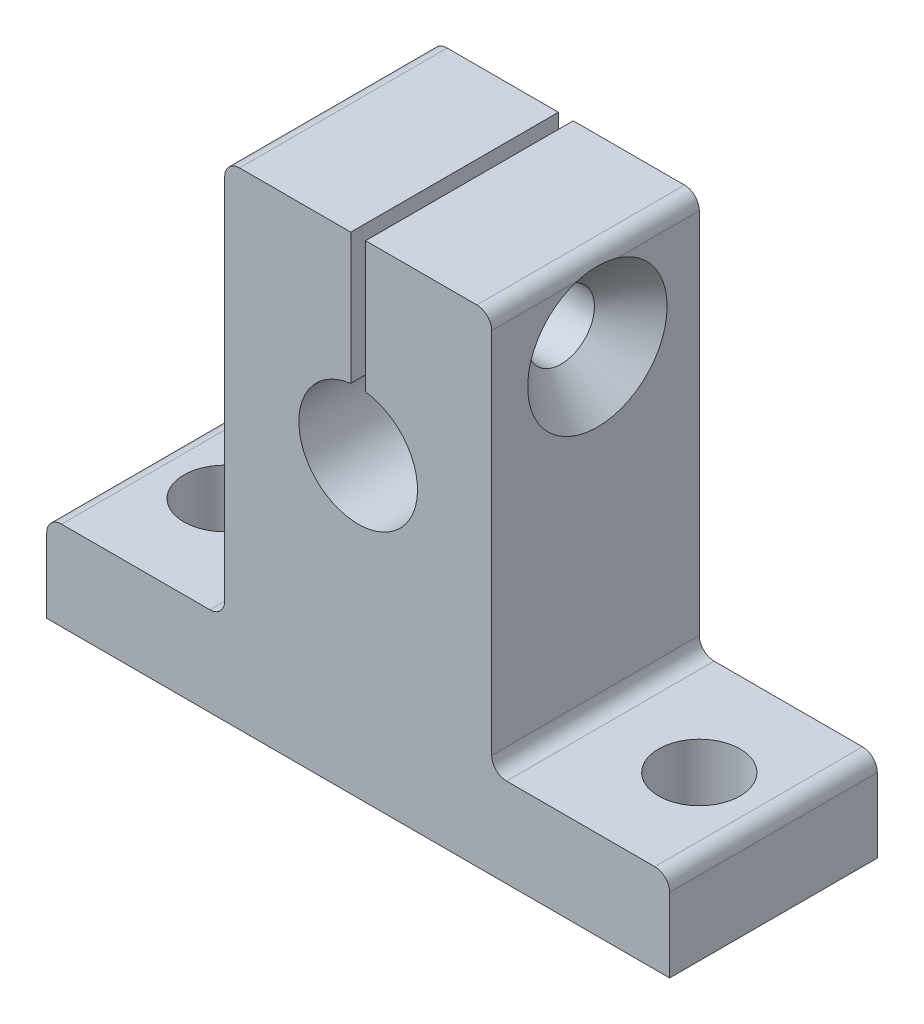
ISO-10303-21;
HEADER;
FILE_DESCRIPTION(('STEP AP214'),'2;1');
FILE_NAME('part.step','',(''),(''),'','','');
FILE_SCHEMA(('AUTOMOTIVE_DESIGN { 1 0 10303 214 1 1 1 1 }'));
ENDSEC;
DATA;
#1=APPLICATION_CONTEXT('core data for automotive mechanical design processes');
#2=APPLICATION_PROTOCOL_DEFINITION('international standard','automotive_design',2000,#1);
#3=PRODUCT_CONTEXT('',#1,'mechanical');
#4=PRODUCT('Part','Part','',(#3));
#5=PRODUCT_RELATED_PRODUCT_CATEGORY('part','',(#4));
#6=PRODUCT_DEFINITION_FORMATION('','',#4);
#7=PRODUCT_DEFINITION_CONTEXT('part definition',#1,'design');
#8=PRODUCT_DEFINITION('design','',#6,#7);
#9=PRODUCT_DEFINITION_SHAPE('','',#8);
#10=(LENGTH_UNIT() NAMED_UNIT(*) SI_UNIT(.MILLI.,.METRE.));
#11=(NAMED_UNIT(*) PLANE_ANGLE_UNIT() SI_UNIT($,.RADIAN.));
#12=(NAMED_UNIT(*) SI_UNIT($,.STERADIAN.) SOLID_ANGLE_UNIT());
#13=UNCERTAINTY_MEASURE_WITH_UNIT(LENGTH_MEASURE(1.E-05),#10,'distance_accuracy_value','');
#14=(GEOMETRIC_REPRESENTATION_CONTEXT(3) GLOBAL_UNCERTAINTY_ASSIGNED_CONTEXT((#13)) GLOBAL_UNIT_ASSIGNED_CONTEXT((#10,
#11,#12)) REPRESENTATION_CONTEXT('',''));
#15=CARTESIAN_POINT('',(0.,0.,0.));
#16=DIRECTION('',(0.,0.,1.));
#17=DIRECTION('',(1.,0.,0.));
#18=AXIS2_PLACEMENT_3D('',#15,#16,#17);
#19=CARTESIAN_POINT('',(-21.,0.,14.));
#20=DIRECTION('',(1.,0.,0.));
#21=DIRECTION('',(0.,0.,-1.));
#22=AXIS2_PLACEMENT_3D('',#19,#20,#21);
#23=PLANE('',#22);
#24=DIRECTION('',(0.,-1.,0.));
#25=VECTOR('',#24,1.);
#26=CARTESIAN_POINT('',(-21.,0.,14.));
#27=LINE('',#26,#25);
#28=CARTESIAN_POINT('',(-21.,5.,14.));
#29=VERTEX_POINT('',#28);
#30=CARTESIAN_POINT('',(-21.,0.,14.));
#31=VERTEX_POINT('',#30);
#32=EDGE_CURVE('E163',#29,#31,#27,.T.);
#33=ORIENTED_EDGE('',*,*,#32,.F.);
#34=DIRECTION('',(0.,0.,-1.));
#35=VECTOR('',#34,1.);
#36=CARTESIAN_POINT('',(-21.,5.,14.));
#37=LINE('',#36,#35);
#38=CARTESIAN_POINT('',(-21.,5.,0.));
#39=VERTEX_POINT('',#38);
#40=EDGE_CURVE('E238',#29,#39,#37,.T.);
#41=ORIENTED_EDGE('',*,*,#40,.T.);
#42=DIRECTION('',(0.,-1.,0.));
#43=VECTOR('',#42,1.);
#44=CARTESIAN_POINT('',(-21.,0.,0.));
#45=LINE('',#44,#43);
#46=CARTESIAN_POINT('',(-21.,0.,0.));
#47=VERTEX_POINT('',#46);
#48=EDGE_CURVE('E188',#39,#47,#45,.T.);
#49=ORIENTED_EDGE('',*,*,#48,.T.);
#50=DIRECTION('',(0.,0.,-1.));
#51=VECTOR('',#50,1.);
#52=CARTESIAN_POINT('',(-21.,0.,14.));
#53=LINE('',#52,#51);
#54=EDGE_CURVE('E181',#31,#47,#53,.T.);
#55=ORIENTED_EDGE('',*,*,#54,.F.);
#56=EDGE_LOOP('',(#33,#41,#49,#55));
#57=FACE_BOUND('',#56,.T.);
#58=ADVANCED_FACE('F32',(#57),#23,.F.);
#59=CARTESIAN_POINT('',(-21.,0.,14.));
#60=DIRECTION('',(0.,1.,0.));
#61=DIRECTION('',(0.,0.,1.));
#62=AXIS2_PLACEMENT_3D('',#59,#60,#61);
#63=PLANE('',#62);
#64=CARTESIAN_POINT('',(-16.,0.,7.));
#65=DIRECTION('',(0.,1.,0.));
#66=DIRECTION('',(0.,0.,1.));
#67=AXIS2_PLACEMENT_3D('',#64,#65,#66);
#68=CIRCLE('',#67,2.75);
#69=CARTESIAN_POINT('',(-16.,0.,9.75));
#70=VERTEX_POINT('',#69);
#71=EDGE_CURVE('E458',#70,#70,#68,.T.);
#72=ORIENTED_EDGE('',*,*,#71,.T.);
#73=EDGE_LOOP('',(#72));
#74=FACE_BOUND('',#73,.T.);
#75=CARTESIAN_POINT('',(16.,0.,7.));
#76=DIRECTION('',(0.,1.,0.));
#77=DIRECTION('',(0.,0.,1.));
#78=AXIS2_PLACEMENT_3D('',#75,#76,#77);
#79=CIRCLE('',#78,2.75);
#80=CARTESIAN_POINT('',(16.,0.,9.75));
#81=VERTEX_POINT('',#80);
#82=EDGE_CURVE('E346',#81,#81,#79,.T.);
#83=ORIENTED_EDGE('',*,*,#82,.T.);
#84=EDGE_LOOP('',(#83));
#85=FACE_BOUND('',#84,.T.);
#86=DIRECTION('',(1.,0.,0.));
#87=VECTOR('',#86,1.);
#88=CARTESIAN_POINT('',(-21.,0.,0.));
#89=LINE('',#88,#87);
#90=CARTESIAN_POINT('',(21.,0.,0.));
#91=VERTEX_POINT('',#90);
#92=EDGE_CURVE('E345',#47,#91,#89,.T.);
#93=ORIENTED_EDGE('',*,*,#92,.T.);
#94=DIRECTION('',(0.,0.,-1.));
#95=VECTOR('',#94,1.);
#96=CARTESIAN_POINT('',(21.,0.,14.));
#97=LINE('',#96,#95);
#98=CARTESIAN_POINT('',(21.,0.,14.));
#99=VERTEX_POINT('',#98);
#100=EDGE_CURVE('E183',#99,#91,#97,.T.);
#101=ORIENTED_EDGE('',*,*,#100,.F.);
#102=DIRECTION('',(1.,0.,0.));
#103=VECTOR('',#102,1.);
#104=CARTESIAN_POINT('',(-21.,0.,14.));
#105=LINE('',#104,#103);
#106=EDGE_CURVE('E167',#31,#99,#105,.T.);
#107=ORIENTED_EDGE('',*,*,#106,.F.);
#108=ORIENTED_EDGE('',*,*,#54,.T.);
#109=EDGE_LOOP('',(#93,#101,#107,#108));
#110=FACE_BOUND('',#109,.T.);
#111=ADVANCED_FACE('F180',(#74,#85,#110),#63,.F.);
#112=CARTESIAN_POINT('',(21.,6.,14.));
#113=DIRECTION('',(-1.,0.,0.));
#114=DIRECTION('',(0.,0.,1.));
#115=AXIS2_PLACEMENT_3D('',#112,#113,#114);
#116=PLANE('',#115);
#117=DIRECTION('',(0.,1.,0.));
#118=VECTOR('',#117,1.);
#119=CARTESIAN_POINT('',(21.,6.,0.));
#120=LINE('',#119,#118);
#121=CARTESIAN_POINT('',(21.,5.,0.));
#122=VERTEX_POINT('',#121);
#123=EDGE_CURVE('E348',#91,#122,#120,.T.);
#124=ORIENTED_EDGE('',*,*,#123,.T.);
#125=DIRECTION('',(0.,0.,-1.));
#126=VECTOR('',#125,1.);
#127=CARTESIAN_POINT('',(21.,5.,14.));
#128=LINE('',#127,#126);
#129=CARTESIAN_POINT('',(21.,5.,14.));
#130=VERTEX_POINT('',#129);
#131=EDGE_CURVE('E230',#122,#130,#128,.F.);
#132=ORIENTED_EDGE('',*,*,#131,.T.);
#133=DIRECTION('',(0.,1.,0.));
#134=VECTOR('',#133,1.);
#135=CARTESIAN_POINT('',(21.,6.,14.));
#136=LINE('',#135,#134);
#137=EDGE_CURVE('E185',#99,#130,#136,.T.);
#138=ORIENTED_EDGE('',*,*,#137,.F.);
#139=ORIENTED_EDGE('',*,*,#100,.T.);
#140=EDGE_LOOP('',(#124,#132,#138,#139));
#141=FACE_BOUND('',#140,.T.);
#142=ADVANCED_FACE('F312',(#141),#116,.F.);
#143=CARTESIAN_POINT('',(9.,6.,14.));
#144=DIRECTION('',(0.,-1.,0.));
#145=DIRECTION('',(0.,0.,-1.));
#146=AXIS2_PLACEMENT_3D('',#143,#144,#145);
#147=PLANE('',#146);
#148=CARTESIAN_POINT('',(16.,6.,7.));
#149=DIRECTION('',(0.,1.,0.));
#150=DIRECTION('',(0.,0.,1.));
#151=AXIS2_PLACEMENT_3D('',#148,#149,#150);
#152=CIRCLE('',#151,2.75);
#153=CARTESIAN_POINT('',(16.,6.,9.75));
#154=VERTEX_POINT('',#153);
#155=EDGE_CURVE('E351',#154,#154,#152,.T.);
#156=ORIENTED_EDGE('',*,*,#155,.F.);
#157=EDGE_LOOP('',(#156));
#158=FACE_BOUND('',#157,.T.);
#159=DIRECTION('',(-1.,0.,0.));
#160=VECTOR('',#159,1.);
#161=CARTESIAN_POINT('',(9.,6.,0.));
#162=LINE('',#161,#160);
#163=CARTESIAN_POINT('',(20.,6.,0.));
#164=VERTEX_POINT('',#163);
#165=CARTESIAN_POINT('',(10.,6.,0.));
#166=VERTEX_POINT('',#165);
#167=EDGE_CURVE('E359',#164,#166,#162,.T.);
#168=ORIENTED_EDGE('',*,*,#167,.T.);
#169=DIRECTION('',(0.,0.,-1.));
#170=VECTOR('',#169,1.);
#171=CARTESIAN_POINT('',(10.,6.,14.));
#172=LINE('',#171,#170);
#173=CARTESIAN_POINT('',(10.,6.,14.));
#174=VERTEX_POINT('',#173);
#175=EDGE_CURVE('E210',#166,#174,#172,.F.);
#176=ORIENTED_EDGE('',*,*,#175,.T.);
#177=DIRECTION('',(-1.,0.,0.));
#178=VECTOR('',#177,1.);
#179=CARTESIAN_POINT('',(9.,6.,14.));
#180=LINE('',#179,#178);
#181=CARTESIAN_POINT('',(20.,6.,14.));
#182=VERTEX_POINT('',#181);
#183=EDGE_CURVE('E432',#182,#174,#180,.T.);
#184=ORIENTED_EDGE('',*,*,#183,.F.);
#185=DIRECTION('',(0.,0.,-1.));
#186=VECTOR('',#185,1.);
#187=CARTESIAN_POINT('',(20.,6.,14.));
#188=LINE('',#187,#186);
#189=EDGE_CURVE('E207',#182,#164,#188,.T.);
#190=ORIENTED_EDGE('',*,*,#189,.T.);
#191=EDGE_LOOP('',(#168,#176,#184,#190));
#192=FACE_BOUND('',#191,.T.);
#193=ADVANCED_FACE('F308',(#158,#192),#147,.F.);
#194=CARTESIAN_POINT('',(9.,32.8,14.));
#195=DIRECTION('',(-1.,0.,0.));
#196=DIRECTION('',(0.,-1.,0.));
#197=AXIS2_PLACEMENT_3D('',#194,#195,#196);
#198=PLANE('',#197);
#199=DIRECTION('',(0.,1.,0.));
#200=VECTOR('',#199,1.);
#201=CARTESIAN_POINT('',(9.,32.8,14.));
#202=LINE('',#201,#200);
#203=CARTESIAN_POINT('',(9.,7.,14.));
#204=VERTEX_POINT('',#203);
#205=CARTESIAN_POINT('',(9.,31.8,14.));
#206=VERTEX_POINT('',#205);
#207=EDGE_CURVE('E431',#204,#206,#202,.T.);
#208=ORIENTED_EDGE('',*,*,#207,.F.);
#209=DIRECTION('',(0.,0.,-1.));
#210=VECTOR('',#209,1.);
#211=CARTESIAN_POINT('',(9.,7.,0.));
#212=LINE('',#211,#210);
#213=CARTESIAN_POINT('',(9.,7.,0.));
#214=VERTEX_POINT('',#213);
#215=EDGE_CURVE('E204',#204,#214,#212,.T.);
#216=ORIENTED_EDGE('',*,*,#215,.T.);
#217=DIRECTION('',(0.,1.,0.));
#218=VECTOR('',#217,1.);
#219=CARTESIAN_POINT('',(9.,32.8,0.));
#220=LINE('',#219,#218);
#221=CARTESIAN_POINT('',(9.,31.8,0.));
#222=VERTEX_POINT('',#221);
#223=EDGE_CURVE('E362',#214,#222,#220,.T.);
#224=ORIENTED_EDGE('',*,*,#223,.T.);
#225=DIRECTION('',(0.,0.,-1.));
#226=VECTOR('',#225,1.);
#227=CARTESIAN_POINT('',(9.,31.8,14.));
#228=LINE('',#227,#226);
#229=CARTESIAN_POINT('',(9.,31.8,5.51490655239453));
#230=VERTEX_POINT('',#229);
#231=EDGE_CURVE('E192',#222,#230,#228,.F.);
#232=ORIENTED_EDGE('',*,*,#231,.T.);
#233=CARTESIAN_POINT('',(9.,27.3,6.87137254901961));
#234=DIRECTION('',(1.,0.,0.));
#235=DIRECTION('',(0.,0.,-1.));
#236=AXIS2_PLACEMENT_3D('',#233,#234,#235);
#237=CIRCLE('',#236,4.7);
#238=CARTESIAN_POINT('',(9.,31.8,8.22783854564468));
#239=VERTEX_POINT('',#238);
#240=EDGE_CURVE('E444',#239,#230,#237,.T.);
#241=ORIENTED_EDGE('',*,*,#240,.F.);
#242=DIRECTION('',(0.,0.,-1.));
#243=VECTOR('',#242,1.);
#244=CARTESIAN_POINT('',(9.,31.8,14.));
#245=LINE('',#244,#243);
#246=EDGE_CURVE('E190',#239,#206,#245,.F.);
#247=ORIENTED_EDGE('',*,*,#246,.T.);
#248=EDGE_LOOP('',(#208,#216,#224,#232,#241,#247));
#249=FACE_BOUND('',#248,.T.);
#250=ADVANCED_FACE('F304',(#249),#198,.F.);
#251=CARTESIAN_POINT('',(0.5,32.8,14.));
#252=DIRECTION('',(0.,-1.,0.));
#253=DIRECTION('',(0.,0.,-1.));
#254=AXIS2_PLACEMENT_3D('',#251,#252,#253);
#255=PLANE('',#254);
#256=DIRECTION('',(-1.,0.,0.));
#257=VECTOR('',#256,1.);
#258=CARTESIAN_POINT('',(0.5,32.8,14.));
#259=LINE('',#258,#257);
#260=CARTESIAN_POINT('',(8.,32.8,14.));
#261=VERTEX_POINT('',#260);
#262=CARTESIAN_POINT('',(0.5,32.8,14.));
#263=VERTEX_POINT('',#262);
#264=EDGE_CURVE('E435',#261,#263,#259,.T.);
#265=ORIENTED_EDGE('',*,*,#264,.F.);
#266=DIRECTION('',(0.,0.,-1.));
#267=VECTOR('',#266,1.);
#268=CARTESIAN_POINT('',(8.,32.8,14.));
#269=LINE('',#268,#267);
#270=CARTESIAN_POINT('',(8.,32.8,0.));
#271=VERTEX_POINT('',#270);
#272=EDGE_CURVE('E240',#261,#271,#269,.T.);
#273=ORIENTED_EDGE('',*,*,#272,.T.);
#274=DIRECTION('',(-1.,0.,0.));
#275=VECTOR('',#274,1.);
#276=CARTESIAN_POINT('',(0.5,32.8,0.));
#277=LINE('',#276,#275);
#278=CARTESIAN_POINT('',(0.5,32.8,0.));
#279=VERTEX_POINT('',#278);
#280=EDGE_CURVE('E365',#271,#279,#277,.T.);
#281=ORIENTED_EDGE('',*,*,#280,.T.);
#282=DIRECTION('',(0.,0.,-1.));
#283=VECTOR('',#282,1.);
#284=CARTESIAN_POINT('',(0.5,32.8,14.));
#285=LINE('',#284,#283);
#286=EDGE_CURVE('E194',#263,#279,#285,.T.);
#287=ORIENTED_EDGE('',*,*,#286,.F.);
#288=EDGE_LOOP('',(#265,#273,#281,#287));
#289=FACE_BOUND('',#288,.T.);
#290=ADVANCED_FACE('F300',(#289),#255,.F.);
#291=CARTESIAN_POINT('',(0.5,23.9686269665969,14.));
#292=DIRECTION('',(1.,0.,0.));
#293=DIRECTION('',(0.,0.,-1.));
#294=AXIS2_PLACEMENT_3D('',#291,#292,#293);
#295=PLANE('',#294);
#296=CARTESIAN_POINT('',(0.5,27.3,6.87137254901961));
#297=DIRECTION('',(1.,0.,0.));
#298=DIRECTION('',(0.,0.,-1.));
#299=AXIS2_PLACEMENT_3D('',#296,#297,#298);
#300=CIRCLE('',#299,2.25);
#301=CARTESIAN_POINT('',(0.5,27.3,4.62137254901961));
#302=VERTEX_POINT('',#301);
#303=EDGE_CURVE('E452',#302,#302,#300,.T.);
#304=ORIENTED_EDGE('',*,*,#303,.T.);
#305=EDGE_LOOP('',(#304));
#306=FACE_BOUND('',#305,.T.);
#307=DIRECTION('',(0.,-1.,0.));
#308=VECTOR('',#307,1.);
#309=CARTESIAN_POINT('',(0.5,23.9686269665969,0.));
#310=LINE('',#309,#308);
#311=CARTESIAN_POINT('',(0.5,23.9686269665969,0.));
#312=VERTEX_POINT('',#311);
#313=EDGE_CURVE('E367',#279,#312,#310,.T.);
#314=ORIENTED_EDGE('',*,*,#313,.T.);
#315=DIRECTION('',(0.,0.,-1.));
#316=VECTOR('',#315,1.);
#317=CARTESIAN_POINT('',(0.5,23.9686269665969,14.));
#318=LINE('',#317,#316);
#319=CARTESIAN_POINT('',(0.5,23.9686269665969,14.));
#320=VERTEX_POINT('',#319);
#321=EDGE_CURVE('E385',#320,#312,#318,.T.);
#322=ORIENTED_EDGE('',*,*,#321,.F.);
#323=DIRECTION('',(0.,-1.,0.));
#324=VECTOR('',#323,1.);
#325=CARTESIAN_POINT('',(0.5,23.9686269665969,14.));
#326=LINE('',#325,#324);
#327=EDGE_CURVE('E393',#263,#320,#326,.T.);
#328=ORIENTED_EDGE('',*,*,#327,.F.);
#329=ORIENTED_EDGE('',*,*,#286,.T.);
#330=EDGE_LOOP('',(#314,#322,#328,#329));
#331=FACE_BOUND('',#330,.T.);
#332=ADVANCED_FACE('F296',(#306,#331),#295,.F.);
#333=CARTESIAN_POINT('',(0.,20.,14.));
#334=DIRECTION('',(0.,0.,-1.));
#335=DIRECTION('',(-1.,0.,0.));
#336=AXIS2_PLACEMENT_3D('',#333,#334,#335);
#337=CYLINDRICAL_SURFACE('',#336,4.);
#338=CARTESIAN_POINT('',(0.,20.,0.));
#339=DIRECTION('',(0.,0.,-1.));
#340=DIRECTION('',(1.,0.,0.));
#341=AXIS2_PLACEMENT_3D('',#338,#339,#340);
#342=CIRCLE('',#341,4.);
#343=CARTESIAN_POINT('',(-0.5,23.9686269665969,0.));
#344=VERTEX_POINT('',#343);
#345=EDGE_CURVE('E369',#312,#344,#342,.T.);
#346=ORIENTED_EDGE('',*,*,#345,.T.);
#347=DIRECTION('',(0.,0.,-1.));
#348=VECTOR('',#347,1.);
#349=CARTESIAN_POINT('',(-0.5,23.9686269665969,14.));
#350=LINE('',#349,#348);
#351=CARTESIAN_POINT('',(-0.5,23.9686269665969,14.));
#352=VERTEX_POINT('',#351);
#353=EDGE_CURVE('E382',#352,#344,#350,.T.);
#354=ORIENTED_EDGE('',*,*,#353,.F.);
#355=CARTESIAN_POINT('',(0.,20.,14.));
#356=DIRECTION('',(0.,0.,-1.));
#357=DIRECTION('',(1.,0.,0.));
#358=AXIS2_PLACEMENT_3D('',#355,#356,#357);
#359=CIRCLE('',#358,4.);
#360=EDGE_CURVE('E405',#320,#352,#359,.T.);
#361=ORIENTED_EDGE('',*,*,#360,.F.);
#362=ORIENTED_EDGE('',*,*,#321,.T.);
#363=EDGE_LOOP('',(#346,#354,#361,#362));
#364=FACE_BOUND('',#363,.T.);
#365=ADVANCED_FACE('F292',(#364),#337,.F.);
#366=CARTESIAN_POINT('',(-0.5,32.8,14.));
#367=DIRECTION('',(-1.,0.,0.));
#368=DIRECTION('',(0.,0.,1.));
#369=AXIS2_PLACEMENT_3D('',#366,#367,#368);
#370=PLANE('',#369);
#371=CARTESIAN_POINT('',(-0.5,27.3,6.87137254901961));
#372=DIRECTION('',(-1.,0.,0.));
#373=DIRECTION('',(0.,0.,1.));
#374=AXIS2_PLACEMENT_3D('',#371,#372,#373);
#375=CIRCLE('',#374,2.25);
#376=CARTESIAN_POINT('',(-0.5,27.3,9.12137254901961));
#377=VERTEX_POINT('',#376);
#378=EDGE_CURVE('E200',#377,#377,#375,.T.);
#379=ORIENTED_EDGE('',*,*,#378,.T.);
#380=EDGE_LOOP('',(#379));
#381=FACE_BOUND('',#380,.T.);
#382=DIRECTION('',(0.,1.,0.));
#383=VECTOR('',#382,1.);
#384=CARTESIAN_POINT('',(-0.5,32.8,0.));
#385=LINE('',#384,#383);
#386=CARTESIAN_POINT('',(-0.5,32.8,0.));
#387=VERTEX_POINT('',#386);
#388=EDGE_CURVE('E371',#344,#387,#385,.T.);
#389=ORIENTED_EDGE('',*,*,#388,.T.);
#390=DIRECTION('',(0.,0.,-1.));
#391=VECTOR('',#390,1.);
#392=CARTESIAN_POINT('',(-0.5,32.8,14.));
#393=LINE('',#392,#391);
#394=CARTESIAN_POINT('',(-0.5,32.8,14.));
#395=VERTEX_POINT('',#394);
#396=EDGE_CURVE('E379',#395,#387,#393,.T.);
#397=ORIENTED_EDGE('',*,*,#396,.F.);
#398=DIRECTION('',(0.,1.,0.));
#399=VECTOR('',#398,1.);
#400=CARTESIAN_POINT('',(-0.5,32.8,14.));
#401=LINE('',#400,#399);
#402=EDGE_CURVE('E403',#352,#395,#401,.T.);
#403=ORIENTED_EDGE('',*,*,#402,.F.);
#404=ORIENTED_EDGE('',*,*,#353,.T.);
#405=EDGE_LOOP('',(#389,#397,#403,#404));
#406=FACE_BOUND('',#405,.T.);
#407=ADVANCED_FACE('F289',(#381,#406),#370,.F.);
#408=CARTESIAN_POINT('',(-9.,32.8,14.));
#409=DIRECTION('',(0.,-1.,0.));
#410=DIRECTION('',(0.,0.,-1.));
#411=AXIS2_PLACEMENT_3D('',#408,#409,#410);
#412=PLANE('',#411);
#413=DIRECTION('',(-1.,0.,0.));
#414=VECTOR('',#413,1.);
#415=CARTESIAN_POINT('',(-9.,32.8,0.));
#416=LINE('',#415,#414);
#417=CARTESIAN_POINT('',(-8.,32.8,0.));
#418=VERTEX_POINT('',#417);
#419=EDGE_CURVE('E373',#387,#418,#416,.T.);
#420=ORIENTED_EDGE('',*,*,#419,.T.);
#421=DIRECTION('',(0.,0.,-1.));
#422=VECTOR('',#421,1.);
#423=CARTESIAN_POINT('',(-8.,32.8,14.));
#424=LINE('',#423,#422);
#425=CARTESIAN_POINT('',(-8.,32.8,14.));
#426=VERTEX_POINT('',#425);
#427=EDGE_CURVE('E47',#418,#426,#424,.F.);
#428=ORIENTED_EDGE('',*,*,#427,.T.);
#429=DIRECTION('',(-1.,0.,0.));
#430=VECTOR('',#429,1.);
#431=CARTESIAN_POINT('',(-9.,32.8,14.));
#432=LINE('',#431,#430);
#433=EDGE_CURVE('E404',#395,#426,#432,.T.);
#434=ORIENTED_EDGE('',*,*,#433,.F.);
#435=ORIENTED_EDGE('',*,*,#396,.T.);
#436=EDGE_LOOP('',(#420,#428,#434,#435));
#437=FACE_BOUND('',#436,.T.);
#438=ADVANCED_FACE('F285',(#437),#412,.F.);
#439=CARTESIAN_POINT('',(-9.,6.,14.));
#440=DIRECTION('',(1.,0.,0.));
#441=DIRECTION('',(0.,1.,0.));
#442=AXIS2_PLACEMENT_3D('',#439,#440,#441);
#443=PLANE('',#442);
#444=CARTESIAN_POINT('',(-9.,27.3,6.87137254901961));
#445=DIRECTION('',(1.,0.,0.));
#446=DIRECTION('',(0.,1.,0.));
#447=AXIS2_PLACEMENT_3D('',#444,#445,#446);
#448=CIRCLE('',#447,2.25);
#449=CARTESIAN_POINT('',(-9.,29.55,6.87137254901961));
#450=VERTEX_POINT('',#449);
#451=EDGE_CURVE('E198',#450,#450,#448,.T.);
#452=ORIENTED_EDGE('',*,*,#451,.T.);
#453=EDGE_LOOP('',(#452));
#454=FACE_BOUND('',#453,.T.);
#455=DIRECTION('',(0.,-1.,0.));
#456=VECTOR('',#455,1.);
#457=CARTESIAN_POINT('',(-9.,6.,0.));
#458=LINE('',#457,#456);
#459=CARTESIAN_POINT('',(-9.,31.8,0.));
#460=VERTEX_POINT('',#459);
#461=CARTESIAN_POINT('',(-9.,7.,0.));
#462=VERTEX_POINT('',#461);
#463=EDGE_CURVE('E375',#460,#462,#458,.T.);
#464=ORIENTED_EDGE('',*,*,#463,.T.);
#465=DIRECTION('',(0.,0.,-1.));
#466=VECTOR('',#465,1.);
#467=CARTESIAN_POINT('',(-9.,7.,14.));
#468=LINE('',#467,#466);
#469=CARTESIAN_POINT('',(-9.,7.,14.));
#470=VERTEX_POINT('',#469);
#471=EDGE_CURVE('E220',#462,#470,#468,.F.);
#472=ORIENTED_EDGE('',*,*,#471,.T.);
#473=DIRECTION('',(0.,-1.,0.));
#474=VECTOR('',#473,1.);
#475=CARTESIAN_POINT('',(-9.,6.,14.));
#476=LINE('',#475,#474);
#477=CARTESIAN_POINT('',(-9.,31.8,14.));
#478=VERTEX_POINT('',#477);
#479=EDGE_CURVE('E407',#478,#470,#476,.T.);
#480=ORIENTED_EDGE('',*,*,#479,.F.);
#481=DIRECTION('',(0.,0.,-1.));
#482=VECTOR('',#481,1.);
#483=CARTESIAN_POINT('',(-9.,31.8,14.));
#484=LINE('',#483,#482);
#485=EDGE_CURVE('E217',#478,#460,#484,.T.);
#486=ORIENTED_EDGE('',*,*,#485,.T.);
#487=EDGE_LOOP('',(#464,#472,#480,#486));
#488=FACE_BOUND('',#487,.T.);
#489=ADVANCED_FACE('F281',(#454,#488),#443,.F.);
#490=CARTESIAN_POINT('',(-21.,6.,14.));
#491=DIRECTION('',(0.,-1.,0.));
#492=DIRECTION('',(0.,0.,-1.));
#493=AXIS2_PLACEMENT_3D('',#490,#491,#492);
#494=PLANE('',#493);
#495=CARTESIAN_POINT('',(-16.,6.,7.));
#496=DIRECTION('',(0.,1.,0.));
#497=DIRECTION('',(0.,0.,1.));
#498=AXIS2_PLACEMENT_3D('',#495,#496,#497);
#499=CIRCLE('',#498,2.75);
#500=CARTESIAN_POINT('',(-16.,6.,9.75));
#501=VERTEX_POINT('',#500);
#502=EDGE_CURVE('E455',#501,#501,#499,.T.);
#503=ORIENTED_EDGE('',*,*,#502,.F.);
#504=EDGE_LOOP('',(#503));
#505=FACE_BOUND('',#504,.T.);
#506=DIRECTION('',(-1.,0.,0.));
#507=VECTOR('',#506,1.);
#508=CARTESIAN_POINT('',(-21.,6.,14.));
#509=LINE('',#508,#507);
#510=CARTESIAN_POINT('',(-10.,6.,14.));
#511=VERTEX_POINT('',#510);
#512=CARTESIAN_POINT('',(-20.,6.,14.));
#513=VERTEX_POINT('',#512);
#514=EDGE_CURVE('E354',#511,#513,#509,.T.);
#515=ORIENTED_EDGE('',*,*,#514,.F.);
#516=DIRECTION('',(0.,0.,-1.));
#517=VECTOR('',#516,1.);
#518=CARTESIAN_POINT('',(-10.,6.,0.));
#519=LINE('',#518,#517);
#520=CARTESIAN_POINT('',(-10.,6.,0.));
#521=VERTEX_POINT('',#520);
#522=EDGE_CURVE('E214',#511,#521,#519,.T.);
#523=ORIENTED_EDGE('',*,*,#522,.T.);
#524=DIRECTION('',(-1.,0.,0.));
#525=VECTOR('',#524,1.);
#526=CARTESIAN_POINT('',(-21.,6.,0.));
#527=LINE('',#526,#525);
#528=CARTESIAN_POINT('',(-20.,6.,0.));
#529=VERTEX_POINT('',#528);
#530=EDGE_CURVE('E176',#521,#529,#527,.T.);
#531=ORIENTED_EDGE('',*,*,#530,.T.);
#532=DIRECTION('',(0.,0.,-1.));
#533=VECTOR('',#532,1.);
#534=CARTESIAN_POINT('',(-20.,6.,14.));
#535=LINE('',#534,#533);
#536=EDGE_CURVE('E212',#529,#513,#535,.F.);
#537=ORIENTED_EDGE('',*,*,#536,.T.);
#538=EDGE_LOOP('',(#515,#523,#531,#537));
#539=FACE_BOUND('',#538,.T.);
#540=ADVANCED_FACE('F275',(#505,#539),#494,.F.);
#541=CARTESIAN_POINT('',(0.,20.,14.));
#542=DIRECTION('',(0.,0.,1.));
#543=DIRECTION('',(1.,0.,0.));
#544=AXIS2_PLACEMENT_3D('',#541,#542,#543);
#545=PLANE('',#544);
#546=ORIENTED_EDGE('',*,*,#137,.T.);
#547=CARTESIAN_POINT('',(20.,5.,14.));
#548=DIRECTION('',(0.,0.,1.));
#549=DIRECTION('',(1.,0.,0.));
#550=AXIS2_PLACEMENT_3D('',#547,#548,#549);
#551=CIRCLE('',#550,1.);
#552=EDGE_CURVE('E236',#130,#182,#551,.T.);
#553=ORIENTED_EDGE('',*,*,#552,.T.);
#554=ORIENTED_EDGE('',*,*,#183,.T.);
#555=CARTESIAN_POINT('',(10.,7.,14.));
#556=DIRECTION('',(0.,0.,1.));
#557=DIRECTION('',(1.,0.,0.));
#558=AXIS2_PLACEMENT_3D('',#555,#556,#557);
#559=CIRCLE('',#558,1.);
#560=EDGE_CURVE('E419',#174,#204,#559,.F.);
#561=ORIENTED_EDGE('',*,*,#560,.T.);
#562=ORIENTED_EDGE('',*,*,#207,.T.);
#563=CARTESIAN_POINT('',(8.,31.8,14.));
#564=DIRECTION('',(0.,0.,1.));
#565=DIRECTION('',(1.,0.,0.));
#566=AXIS2_PLACEMENT_3D('',#563,#564,#565);
#567=CIRCLE('',#566,1.);
#568=EDGE_CURVE('E55',#206,#261,#567,.T.);
#569=ORIENTED_EDGE('',*,*,#568,.T.);
#570=ORIENTED_EDGE('',*,*,#264,.T.);
#571=ORIENTED_EDGE('',*,*,#327,.T.);
#572=ORIENTED_EDGE('',*,*,#360,.T.);
#573=ORIENTED_EDGE('',*,*,#402,.T.);
#574=ORIENTED_EDGE('',*,*,#433,.T.);
#575=CARTESIAN_POINT('',(-8.,31.8,14.));
#576=DIRECTION('',(0.,0.,1.));
#577=DIRECTION('',(1.,0.,0.));
#578=AXIS2_PLACEMENT_3D('',#575,#576,#577);
#579=CIRCLE('',#578,1.);
#580=EDGE_CURVE('E232',#426,#478,#579,.T.);
#581=ORIENTED_EDGE('',*,*,#580,.T.);
#582=ORIENTED_EDGE('',*,*,#479,.T.);
#583=CARTESIAN_POINT('',(-10.,7.,14.));
#584=DIRECTION('',(0.,0.,1.));
#585=DIRECTION('',(1.,0.,0.));
#586=AXIS2_PLACEMENT_3D('',#583,#584,#585);
#587=CIRCLE('',#586,1.);
#588=EDGE_CURVE('E11',#470,#511,#587,.F.);
#589=ORIENTED_EDGE('',*,*,#588,.T.);
#590=ORIENTED_EDGE('',*,*,#514,.T.);
#591=CARTESIAN_POINT('',(-20.,5.,14.));
#592=DIRECTION('',(0.,0.,1.));
#593=DIRECTION('',(1.,0.,0.));
#594=AXIS2_PLACEMENT_3D('',#591,#592,#593);
#595=CIRCLE('',#594,1.);
#596=EDGE_CURVE('E171',#513,#29,#595,.T.);
#597=ORIENTED_EDGE('',*,*,#596,.T.);
#598=ORIENTED_EDGE('',*,*,#32,.T.);
#599=ORIENTED_EDGE('',*,*,#106,.T.);
#600=EDGE_LOOP('',(#546,#553,#554,#561,#562,#569,#570,#571,#572,#573,#574,#581,#582,#589,#590,
#597,#598,#599));
#601=FACE_BOUND('',#600,.T.);
#602=ADVANCED_FACE('F166',(#601),#545,.T.);
#603=CARTESIAN_POINT('',(0.,20.,0.));
#604=DIRECTION('',(0.,0.,1.));
#605=DIRECTION('',(1.,0.,0.));
#606=AXIS2_PLACEMENT_3D('',#603,#604,#605);
#607=PLANE('',#606);
#608=ORIENTED_EDGE('',*,*,#167,.F.);
#609=CARTESIAN_POINT('',(20.,5.,0.));
#610=DIRECTION('',(0.,0.,1.));
#611=DIRECTION('',(1.,0.,0.));
#612=AXIS2_PLACEMENT_3D('',#609,#610,#611);
#613=CIRCLE('',#612,1.);
#614=EDGE_CURVE('E228',#164,#122,#613,.F.);
#615=ORIENTED_EDGE('',*,*,#614,.T.);
#616=ORIENTED_EDGE('',*,*,#123,.F.);
#617=ORIENTED_EDGE('',*,*,#92,.F.);
#618=ORIENTED_EDGE('',*,*,#48,.F.);
#619=CARTESIAN_POINT('',(-20.,5.,0.));
#620=DIRECTION('',(0.,0.,1.));
#621=DIRECTION('',(1.,0.,0.));
#622=AXIS2_PLACEMENT_3D('',#619,#620,#621);
#623=CIRCLE('',#622,1.);
#624=EDGE_CURVE('E226',#39,#529,#623,.F.);
#625=ORIENTED_EDGE('',*,*,#624,.T.);
#626=ORIENTED_EDGE('',*,*,#530,.F.);
#627=CARTESIAN_POINT('',(-10.,7.,0.));
#628=DIRECTION('',(0.,0.,1.));
#629=DIRECTION('',(1.,0.,0.));
#630=AXIS2_PLACEMENT_3D('',#627,#628,#629);
#631=CIRCLE('',#630,1.);
#632=EDGE_CURVE('E40',#521,#462,#631,.T.);
#633=ORIENTED_EDGE('',*,*,#632,.T.);
#634=ORIENTED_EDGE('',*,*,#463,.F.);
#635=CARTESIAN_POINT('',(-8.,31.8,0.));
#636=DIRECTION('',(0.,0.,1.));
#637=DIRECTION('',(1.,0.,0.));
#638=AXIS2_PLACEMENT_3D('',#635,#636,#637);
#639=CIRCLE('',#638,1.);
#640=EDGE_CURVE('E222',#460,#418,#639,.F.);
#641=ORIENTED_EDGE('',*,*,#640,.T.);
#642=ORIENTED_EDGE('',*,*,#419,.F.);
#643=ORIENTED_EDGE('',*,*,#388,.F.);
#644=ORIENTED_EDGE('',*,*,#345,.F.);
#645=ORIENTED_EDGE('',*,*,#313,.F.);
#646=ORIENTED_EDGE('',*,*,#280,.F.);
#647=CARTESIAN_POINT('',(8.,31.8,0.));
#648=DIRECTION('',(0.,0.,1.));
#649=DIRECTION('',(1.,0.,0.));
#650=AXIS2_PLACEMENT_3D('',#647,#648,#649);
#651=CIRCLE('',#650,1.);
#652=EDGE_CURVE('E224',#271,#222,#651,.F.);
#653=ORIENTED_EDGE('',*,*,#652,.T.);
#654=ORIENTED_EDGE('',*,*,#223,.F.);
#655=CARTESIAN_POINT('',(10.,7.,0.));
#656=DIRECTION('',(0.,0.,1.));
#657=DIRECTION('',(1.,0.,0.));
#658=AXIS2_PLACEMENT_3D('',#655,#656,#657);
#659=CIRCLE('',#658,1.);
#660=EDGE_CURVE('E420',#214,#166,#659,.T.);
#661=ORIENTED_EDGE('',*,*,#660,.T.);
#662=EDGE_LOOP('',(#608,#615,#616,#617,#618,#625,#626,#633,#634,#641,#642,#643,#644,#645,#646,
#653,#654,#661));
#663=FACE_BOUND('',#662,.T.);
#664=ADVANCED_FACE('F271',(#663),#607,.F.);
#665=CARTESIAN_POINT('',(16.,6.,7.));
#666=DIRECTION('',(0.,1.,0.));
#667=DIRECTION('',(0.,0.,1.));
#668=AXIS2_PLACEMENT_3D('',#665,#666,#667);
#669=CYLINDRICAL_SURFACE('',#668,2.75);
#670=ORIENTED_EDGE('',*,*,#82,.F.);
#671=EDGE_LOOP('',(#670));
#672=FACE_BOUND('',#671,.T.);
#673=ORIENTED_EDGE('',*,*,#155,.T.);
#674=EDGE_LOOP('',(#673));
#675=FACE_BOUND('',#674,.T.);
#676=ADVANCED_FACE('F267',(#672,#675),#669,.F.);
#677=CARTESIAN_POINT('',(-16.,6.,7.));
#678=DIRECTION('',(0.,1.,0.));
#679=DIRECTION('',(0.,0.,1.));
#680=AXIS2_PLACEMENT_3D('',#677,#678,#679);
#681=CYLINDRICAL_SURFACE('',#680,2.75);
#682=ORIENTED_EDGE('',*,*,#71,.F.);
#683=EDGE_LOOP('',(#682));
#684=FACE_BOUND('',#683,.T.);
#685=ORIENTED_EDGE('',*,*,#502,.T.);
#686=EDGE_LOOP('',(#685));
#687=FACE_BOUND('',#686,.T.);
#688=ADVANCED_FACE('F259',(#684,#687),#681,.F.);
#689=CARTESIAN_POINT('',(9.,27.3,6.87137254901961));
#690=DIRECTION('',(1.,0.,0.));
#691=DIRECTION('',(0.,0.,-1.));
#692=AXIS2_PLACEMENT_3D('',#689,#690,#691);
#693=CONICAL_SURFACE('',#692,4.7,0.785398163397449);
#694=CARTESIAN_POINT('',(6.55,27.3,6.87137254901961));
#695=DIRECTION('',(1.,0.,0.));
#696=DIRECTION('',(0.,0.,-1.));
#697=AXIS2_PLACEMENT_3D('',#694,#695,#696);
#698=CIRCLE('',#697,2.25);
#699=CARTESIAN_POINT('',(6.55,27.3,4.62137254901961));
#700=VERTEX_POINT('',#699);
#701=EDGE_CURVE('E201',#700,#700,#698,.T.);
#702=ORIENTED_EDGE('',*,*,#701,.F.);
#703=EDGE_LOOP('',(#702));
#704=FACE_BOUND('',#703,.T.);
#705=ORIENTED_EDGE('',*,*,#240,.T.);
#706=CARTESIAN_POINT('',(9.,31.8,5.51490655239453));
#707=CARTESIAN_POINT('',(8.99997549095255,31.8181621447696,5.57524129838322));
#708=CARTESIAN_POINT('',(8.9995054196023,31.8346765961807,5.63604733157055));
#709=CARTESIAN_POINT('',(8.99802356684835,31.8647112092317,5.75835949848497));
#710=CARTESIAN_POINT('',(8.99701205319558,31.8782328461933,5.81986527147945));
#711=CARTESIAN_POINT('',(8.9947975466302,31.9025834380919,5.94330918648677));
#712=CARTESIAN_POINT('',(8.99359482007314,31.9134160857469,6.00524661411655));
#713=CARTESIAN_POINT('',(8.9912151110748,31.9326114358132,6.12950827419393));
#714=CARTESIAN_POINT('',(8.99003813230821,31.9409737877704,6.1918325602448));
#715=CARTESIAN_POINT('',(8.98684768353988,31.9623067448905,6.37677317303506));
#716=CARTESIAN_POINT('',(8.98511699731676,31.9719855887302,6.49978541491866));
#717=CARTESIAN_POINT('',(8.98311486073125,31.9830684215225,6.74623781235953));
#718=CARTESIAN_POINT('',(8.98284412213169,31.9844683743303,6.86967814728461));
#719=CARTESIAN_POINT('',(8.98376049275493,31.9794926670561,7.09647360852246));
#720=CARTESIAN_POINT('',(8.98471956556291,31.9743344133322,7.19985786077101));
#721=CARTESIAN_POINT('',(8.98747211807146,31.9580207563227,7.40609286165659));
#722=CARTESIAN_POINT('',(8.98926507173343,31.9468691331566,7.50894390535881));
#723=CARTESIAN_POINT('',(8.99216542501334,31.925139800902,7.66337063946918));
#724=CARTESIAN_POINT('',(8.99317649651846,31.9169753832732,7.71529526386972));
#725=CARTESIAN_POINT('',(8.99514378295837,31.8988543355296,7.81882926471371));
#726=CARTESIAN_POINT('',(8.99610000349511,31.8888978888663,7.87043867286747));
#727=CARTESIAN_POINT('',(8.99781125883577,31.8670440350859,7.97332910337057));
#728=CARTESIAN_POINT('',(8.99856600411707,31.8551438739589,8.02460955089168));
#729=CARTESIAN_POINT('',(8.99965406263142,31.8292158333824,8.12665150761141));
#730=CARTESIAN_POINT('',(8.99998722777262,31.8151872081871,8.17741282824465));
#731=CARTESIAN_POINT('',(9.,31.8,8.22783854564468));
#732=B_SPLINE_CURVE_WITH_KNOTS('',3,(#706,#707,#708,#709,#710,#711,#712,#713,#714,#715,#716,
#717,#718,#719,#720,#721,#722,#723,#724,#725,#726,#727,#728,#729,#730,#731),.UNSPECIFIED.,.F.,
.F.,(4,2,2,2,2,2,2,2,2,2,2,2,4),(0.,0.188968345105213,0.377843328890295,0.566457482584663,
0.755098381629367,1.12498179441435,1.49504551878806,1.80543698601168,2.11563291344241,
2.27332432489546,2.43099960252708,2.5889002565717,2.74685636226337),.UNSPECIFIED.);
#733=EDGE_CURVE('E243',#230,#239,#732,.T.);
#734=ORIENTED_EDGE('',*,*,#733,.T.);
#735=EDGE_LOOP('',(#705,#734));
#736=FACE_BOUND('',#735,.T.);
#737=ADVANCED_FACE('F254',(#704,#736),#693,.F.);
#738=CARTESIAN_POINT('',(9.,27.3,6.87137254901961));
#739=DIRECTION('',(1.,0.,0.));
#740=DIRECTION('',(0.,0.,-1.));
#741=AXIS2_PLACEMENT_3D('',#738,#739,#740);
#742=CYLINDRICAL_SURFACE('',#741,2.25);
#743=ORIENTED_EDGE('',*,*,#701,.T.);
#744=EDGE_LOOP('',(#743));
#745=FACE_BOUND('',#744,.T.);
#746=ORIENTED_EDGE('',*,*,#303,.F.);
#747=EDGE_LOOP('',(#746));
#748=FACE_BOUND('',#747,.T.);
#749=ADVANCED_FACE('F258',(#745,#748),#742,.F.);
#750=ORIENTED_EDGE('',*,*,#451,.F.);
#751=EDGE_LOOP('',(#750));
#752=FACE_BOUND('',#751,.T.);
#753=ORIENTED_EDGE('',*,*,#378,.F.);
#754=EDGE_LOOP('',(#753));
#755=FACE_BOUND('',#754,.T.);
#756=ADVANCED_FACE('F263',(#752,#755),#742,.F.);
#757=CARTESIAN_POINT('',(10.,7.,14.));
#758=DIRECTION('',(0.,0.,1.));
#759=DIRECTION('',(1.,0.,0.));
#760=AXIS2_PLACEMENT_3D('',#757,#758,#759);
#761=CYLINDRICAL_SURFACE('',#760,1.);
#762=ORIENTED_EDGE('',*,*,#560,.F.);
#763=ORIENTED_EDGE('',*,*,#175,.F.);
#764=ORIENTED_EDGE('',*,*,#660,.F.);
#765=ORIENTED_EDGE('',*,*,#215,.F.);
#766=EDGE_LOOP('',(#762,#763,#764,#765));
#767=FACE_BOUND('',#766,.T.);
#768=ADVANCED_FACE('F322',(#767),#761,.F.);
#769=CARTESIAN_POINT('',(-10.,7.,14.));
#770=DIRECTION('',(0.,0.,1.));
#771=DIRECTION('',(1.,0.,0.));
#772=AXIS2_PLACEMENT_3D('',#769,#770,#771);
#773=CYLINDRICAL_SURFACE('',#772,1.);
#774=ORIENTED_EDGE('',*,*,#588,.F.);
#775=ORIENTED_EDGE('',*,*,#471,.F.);
#776=ORIENTED_EDGE('',*,*,#632,.F.);
#777=ORIENTED_EDGE('',*,*,#522,.F.);
#778=EDGE_LOOP('',(#774,#775,#776,#777));
#779=FACE_BOUND('',#778,.T.);
#780=ADVANCED_FACE('F325',(#779),#773,.F.);
#781=CARTESIAN_POINT('',(20.,5.,14.));
#782=DIRECTION('',(0.,0.,-1.));
#783=DIRECTION('',(-1.,0.,0.));
#784=AXIS2_PLACEMENT_3D('',#781,#782,#783);
#785=CYLINDRICAL_SURFACE('',#784,1.);
#786=ORIENTED_EDGE('',*,*,#552,.F.);
#787=ORIENTED_EDGE('',*,*,#131,.F.);
#788=ORIENTED_EDGE('',*,*,#614,.F.);
#789=ORIENTED_EDGE('',*,*,#189,.F.);
#790=EDGE_LOOP('',(#786,#787,#788,#789));
#791=FACE_BOUND('',#790,.T.);
#792=ADVANCED_FACE('F329',(#791),#785,.T.);
#793=CARTESIAN_POINT('',(-20.,5.,14.));
#794=DIRECTION('',(0.,0.,-1.));
#795=DIRECTION('',(-1.,0.,0.));
#796=AXIS2_PLACEMENT_3D('',#793,#794,#795);
#797=CYLINDRICAL_SURFACE('',#796,1.);
#798=ORIENTED_EDGE('',*,*,#596,.F.);
#799=ORIENTED_EDGE('',*,*,#536,.F.);
#800=ORIENTED_EDGE('',*,*,#624,.F.);
#801=ORIENTED_EDGE('',*,*,#40,.F.);
#802=EDGE_LOOP('',(#798,#799,#800,#801));
#803=FACE_BOUND('',#802,.T.);
#804=ADVANCED_FACE('F332',(#803),#797,.T.);
#805=CARTESIAN_POINT('',(8.,31.8,14.));
#806=DIRECTION('',(0.,0.,-1.));
#807=DIRECTION('',(-1.,0.,0.));
#808=AXIS2_PLACEMENT_3D('',#805,#806,#807);
#809=CYLINDRICAL_SURFACE('',#808,1.);
#810=ORIENTED_EDGE('',*,*,#733,.F.);
#811=ORIENTED_EDGE('',*,*,#231,.F.);
#812=ORIENTED_EDGE('',*,*,#652,.F.);
#813=ORIENTED_EDGE('',*,*,#272,.F.);
#814=ORIENTED_EDGE('',*,*,#568,.F.);
#815=ORIENTED_EDGE('',*,*,#246,.F.);
#816=EDGE_LOOP('',(#810,#811,#812,#813,#814,#815));
#817=FACE_BOUND('',#816,.T.);
#818=ADVANCED_FACE('F251',(#817),#809,.T.);
#819=CARTESIAN_POINT('',(-8.,31.8,14.));
#820=DIRECTION('',(0.,0.,-1.));
#821=DIRECTION('',(-1.,0.,0.));
#822=AXIS2_PLACEMENT_3D('',#819,#820,#821);
#823=CYLINDRICAL_SURFACE('',#822,1.);
#824=ORIENTED_EDGE('',*,*,#580,.F.);
#825=ORIENTED_EDGE('',*,*,#427,.F.);
#826=ORIENTED_EDGE('',*,*,#640,.F.);
#827=ORIENTED_EDGE('',*,*,#485,.F.);
#828=EDGE_LOOP('',(#824,#825,#826,#827));
#829=FACE_BOUND('',#828,.T.);
#830=ADVANCED_FACE('F34',(#829),#823,.T.);
#831=CLOSED_SHELL('',(#58,#111,#142,#193,#250,#290,#332,#365,#407,#438,#489,#540,#602,#664,#676,
#688,#737,#749,#756,#768,#780,#792,#804,#818,#830));
#832=MANIFOLD_SOLID_BREP('B2',#831);
#833=ADVANCED_BREP_SHAPE_REPRESENTATION('',(#18,#832),#14);
#834=SHAPE_DEFINITION_REPRESENTATION(#9,#833);
ENDSEC;
END-ISO-10303-21;
